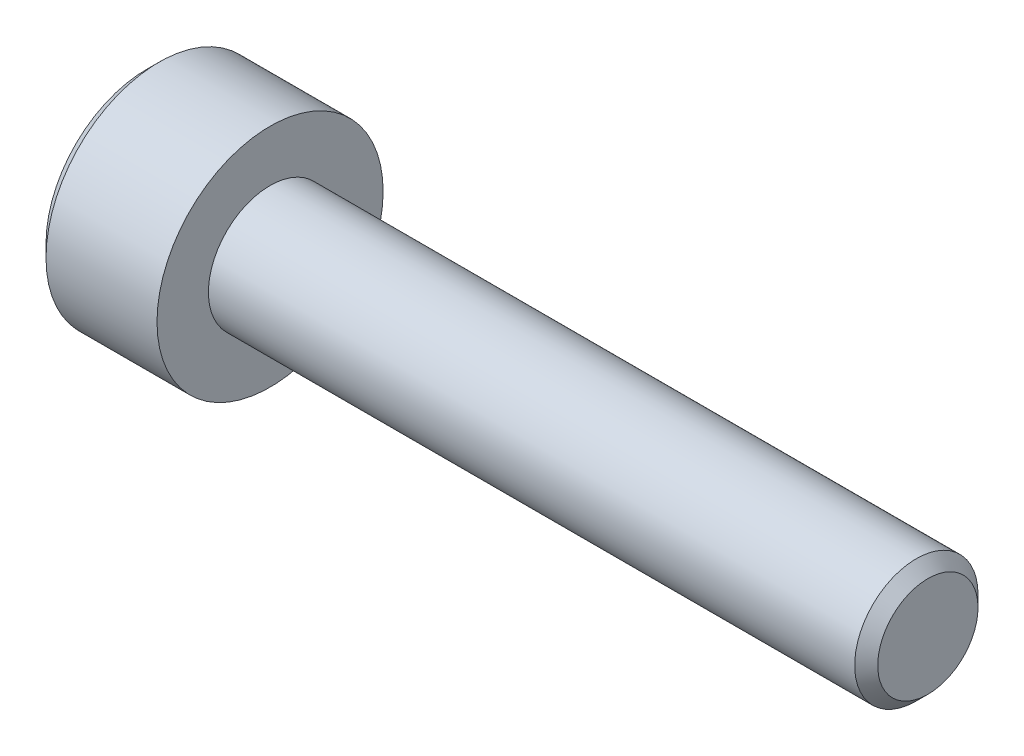
ISO-10303-21;
HEADER;
FILE_DESCRIPTION(('STEP AP214'),'2;1');
FILE_NAME('part.step','',(''),(''),'','','');
FILE_SCHEMA(('AUTOMOTIVE_DESIGN { 1 0 10303 214 1 1 1 1 }'));
ENDSEC;
DATA;
#1=APPLICATION_CONTEXT('core data for automotive mechanical design processes');
#2=APPLICATION_PROTOCOL_DEFINITION('international standard','automotive_design',2000,#1);
#3=PRODUCT_CONTEXT('',#1,'mechanical');
#4=PRODUCT('Part','Part','',(#3));
#5=PRODUCT_RELATED_PRODUCT_CATEGORY('part','',(#4));
#6=PRODUCT_DEFINITION_FORMATION('','',#4);
#7=PRODUCT_DEFINITION_CONTEXT('part definition',#1,'design');
#8=PRODUCT_DEFINITION('design','',#6,#7);
#9=PRODUCT_DEFINITION_SHAPE('','',#8);
#10=(LENGTH_UNIT() NAMED_UNIT(*) SI_UNIT(.MILLI.,.METRE.));
#11=(NAMED_UNIT(*) PLANE_ANGLE_UNIT() SI_UNIT($,.RADIAN.));
#12=(NAMED_UNIT(*) SI_UNIT($,.STERADIAN.) SOLID_ANGLE_UNIT());
#13=UNCERTAINTY_MEASURE_WITH_UNIT(LENGTH_MEASURE(1.E-05),#10,'distance_accuracy_value','');
#14=(GEOMETRIC_REPRESENTATION_CONTEXT(3) GLOBAL_UNCERTAINTY_ASSIGNED_CONTEXT((#13)) GLOBAL_UNIT_ASSIGNED_CONTEXT((#10,
#11,#12)) REPRESENTATION_CONTEXT('',''));
#15=CARTESIAN_POINT('',(0.,0.,0.));
#16=DIRECTION('',(0.,0.,1.));
#17=DIRECTION('',(1.,0.,0.));
#18=AXIS2_PLACEMENT_3D('',#15,#16,#17);
#19=CARTESIAN_POINT('',(1.3,0.,0.));
#20=DIRECTION('',(-1.,0.,0.));
#21=DIRECTION('',(0.,0.,1.));
#22=AXIS2_PLACEMENT_3D('',#19,#20,#21);
#23=CONICAL_SURFACE('',#22,1.28,1.0471975511966);
#24=DIRECTION('',(-0.5,0.,-0.86602540378444));
#25=VECTOR('',#24,1.);
#26=CARTESIAN_POINT('',(1.3,0.,-1.28));
#27=LINE('',#26,#25);
#28=CARTESIAN_POINT('',(2.03900834456273,0.,0.));
#29=VERTEX_POINT('',#28);
#30=CARTESIAN_POINT('',(1.3,0.,-1.28));
#31=VERTEX_POINT('',#30);
#32=EDGE_CURVE('E11',#29,#31,#27,.T.);
#33=ORIENTED_EDGE('',*,*,#32,.T.);
#34=CARTESIAN_POINT('',(1.3,0.,0.));
#35=DIRECTION('',(-1.,0.,0.));
#36=DIRECTION('',(0.,0.,1.));
#37=AXIS2_PLACEMENT_3D('',#34,#35,#36);
#38=CIRCLE('',#37,1.28);
#39=CARTESIAN_POINT('',(1.3,-1.10851251684408,-0.64));
#40=VERTEX_POINT('',#39);
#41=EDGE_CURVE('E221',#31,#40,#38,.T.);
#42=ORIENTED_EDGE('',*,*,#41,.T.);
#43=CARTESIAN_POINT('',(1.3,0.,0.));
#44=DIRECTION('',(-1.,0.,0.));
#45=DIRECTION('',(0.,0.,1.));
#46=AXIS2_PLACEMENT_3D('',#43,#44,#45);
#47=CIRCLE('',#46,1.28);
#48=CARTESIAN_POINT('',(1.3,-1.10851251684408,0.64));
#49=VERTEX_POINT('',#48);
#50=EDGE_CURVE('E216',#40,#49,#47,.T.);
#51=ORIENTED_EDGE('',*,*,#50,.T.);
#52=CARTESIAN_POINT('',(1.3,0.,0.));
#53=DIRECTION('',(-1.,0.,0.));
#54=DIRECTION('',(0.,0.,1.));
#55=AXIS2_PLACEMENT_3D('',#52,#53,#54);
#56=CIRCLE('',#55,1.28);
#57=CARTESIAN_POINT('',(1.3,0.,1.28));
#58=VERTEX_POINT('',#57);
#59=EDGE_CURVE('E220',#49,#58,#56,.T.);
#60=ORIENTED_EDGE('',*,*,#59,.T.);
#61=CARTESIAN_POINT('',(1.3,0.,0.));
#62=DIRECTION('',(-1.,0.,0.));
#63=DIRECTION('',(0.,0.,1.));
#64=AXIS2_PLACEMENT_3D('',#61,#62,#63);
#65=CIRCLE('',#64,1.28);
#66=CARTESIAN_POINT('',(1.3,1.10851251684408,0.64));
#67=VERTEX_POINT('',#66);
#68=EDGE_CURVE('E253',#58,#67,#65,.T.);
#69=ORIENTED_EDGE('',*,*,#68,.T.);
#70=CARTESIAN_POINT('',(1.3,0.,0.));
#71=DIRECTION('',(-1.,0.,0.));
#72=DIRECTION('',(0.,0.,1.));
#73=AXIS2_PLACEMENT_3D('',#70,#71,#72);
#74=CIRCLE('',#73,1.28);
#75=CARTESIAN_POINT('',(1.3,1.10851251684408,-0.64));
#76=VERTEX_POINT('',#75);
#77=EDGE_CURVE('E262',#67,#76,#74,.T.);
#78=ORIENTED_EDGE('',*,*,#77,.T.);
#79=CARTESIAN_POINT('',(1.3,0.,0.));
#80=DIRECTION('',(-1.,0.,0.));
#81=DIRECTION('',(0.,0.,1.));
#82=AXIS2_PLACEMENT_3D('',#79,#80,#81);
#83=CIRCLE('',#82,1.28);
#84=EDGE_CURVE('E28',#76,#31,#83,.T.);
#85=ORIENTED_EDGE('',*,*,#84,.T.);
#86=ORIENTED_EDGE('',*,*,#32,.F.);
#87=EDGE_LOOP('',(#33,#42,#51,#60,#69,#78,#85,#86));
#88=FACE_BOUND('',#87,.T.);
#89=ADVANCED_FACE('F17',(#88),#23,.F.);
#90=CARTESIAN_POINT('',(1.3,1.47801668912544,0.));
#91=DIRECTION('',(1.,0.,0.));
#92=DIRECTION('',(0.,1.,0.));
#93=AXIS2_PLACEMENT_3D('',#90,#91,#92);
#94=PLANE('',#93);
#95=DIRECTION('',(0.,-0.5,-0.866025403784439));
#96=VECTOR('',#95,1.);
#97=CARTESIAN_POINT('',(1.3,1.10851251684408,-0.64));
#98=LINE('',#97,#96);
#99=CARTESIAN_POINT('',(1.3,0.739008344562717,-1.28));
#100=VERTEX_POINT('',#99);
#101=EDGE_CURVE('E337',#76,#100,#98,.T.);
#102=ORIENTED_EDGE('',*,*,#101,.T.);
#103=DIRECTION('',(0.,-1.,0.));
#104=VECTOR('',#103,1.);
#105=CARTESIAN_POINT('',(1.3,0.739008344562717,-1.28));
#106=LINE('',#105,#104);
#107=EDGE_CURVE('E235',#100,#31,#106,.T.);
#108=ORIENTED_EDGE('',*,*,#107,.T.);
#109=ORIENTED_EDGE('',*,*,#84,.F.);
#110=EDGE_LOOP('',(#102,#108,#109));
#111=FACE_BOUND('',#110,.T.);
#112=ADVANCED_FACE('F353',(#111),#94,.F.);
#113=CARTESIAN_POINT('',(1.3,1.47801668912544,0.));
#114=DIRECTION('',(1.,0.,0.));
#115=DIRECTION('',(0.,1.,0.));
#116=AXIS2_PLACEMENT_3D('',#113,#114,#115);
#117=PLANE('',#116);
#118=DIRECTION('',(0.,-0.5,0.866025403784438));
#119=VECTOR('',#118,1.);
#120=CARTESIAN_POINT('',(1.3,1.47801668912544,0.));
#121=LINE('',#120,#119);
#122=CARTESIAN_POINT('',(1.3,1.47801668912544,0.));
#123=VERTEX_POINT('',#122);
#124=EDGE_CURVE('E215',#123,#67,#121,.T.);
#125=ORIENTED_EDGE('',*,*,#124,.F.);
#126=DIRECTION('',(0.,-0.5,-0.866025403784438));
#127=VECTOR('',#126,1.);
#128=CARTESIAN_POINT('',(1.3,1.47801668912544,0.));
#129=LINE('',#128,#127);
#130=EDGE_CURVE('E326',#123,#76,#129,.T.);
#131=ORIENTED_EDGE('',*,*,#130,.T.);
#132=ORIENTED_EDGE('',*,*,#77,.F.);
#133=EDGE_LOOP('',(#125,#131,#132));
#134=FACE_BOUND('',#133,.T.);
#135=ADVANCED_FACE('F378',(#134),#117,.F.);
#136=CARTESIAN_POINT('',(1.3,1.47801668912544,0.));
#137=DIRECTION('',(1.,0.,0.));
#138=DIRECTION('',(0.,1.,0.));
#139=AXIS2_PLACEMENT_3D('',#136,#137,#138);
#140=PLANE('',#139);
#141=DIRECTION('',(0.,1.,0.));
#142=VECTOR('',#141,1.);
#143=CARTESIAN_POINT('',(1.3,0.,1.28));
#144=LINE('',#143,#142);
#145=CARTESIAN_POINT('',(1.3,0.739008344562719,1.28));
#146=VERTEX_POINT('',#145);
#147=EDGE_CURVE('E203',#58,#146,#144,.T.);
#148=ORIENTED_EDGE('',*,*,#147,.T.);
#149=DIRECTION('',(0.,-0.5,0.866025403784439));
#150=VECTOR('',#149,1.);
#151=CARTESIAN_POINT('',(1.3,1.10851251684408,0.64));
#152=LINE('',#151,#150);
#153=EDGE_CURVE('E225',#67,#146,#152,.T.);
#154=ORIENTED_EDGE('',*,*,#153,.F.);
#155=ORIENTED_EDGE('',*,*,#68,.F.);
#156=EDGE_LOOP('',(#148,#154,#155));
#157=FACE_BOUND('',#156,.T.);
#158=ADVANCED_FACE('F370',(#157),#140,.F.);
#159=CARTESIAN_POINT('',(1.3,1.47801668912544,0.));
#160=DIRECTION('',(1.,0.,0.));
#161=DIRECTION('',(0.,1.,0.));
#162=AXIS2_PLACEMENT_3D('',#159,#160,#161);
#163=PLANE('',#162);
#164=DIRECTION('',(0.,-0.5,-0.866025403784439));
#165=VECTOR('',#164,1.);
#166=CARTESIAN_POINT('',(1.3,-0.739008344562723,1.28));
#167=LINE('',#166,#165);
#168=CARTESIAN_POINT('',(1.3,-0.739008344562723,1.28));
#169=VERTEX_POINT('',#168);
#170=EDGE_CURVE('E189',#169,#49,#167,.T.);
#171=ORIENTED_EDGE('',*,*,#170,.F.);
#172=DIRECTION('',(0.,1.,0.));
#173=VECTOR('',#172,1.);
#174=CARTESIAN_POINT('',(1.3,-0.739008344562723,1.28));
#175=LINE('',#174,#173);
#176=EDGE_CURVE('E190',#169,#58,#175,.T.);
#177=ORIENTED_EDGE('',*,*,#176,.T.);
#178=ORIENTED_EDGE('',*,*,#59,.F.);
#179=EDGE_LOOP('',(#171,#177,#178));
#180=FACE_BOUND('',#179,.T.);
#181=ADVANCED_FACE('F364',(#180),#163,.F.);
#182=CARTESIAN_POINT('',(1.3,1.47801668912544,0.));
#183=DIRECTION('',(1.,0.,0.));
#184=DIRECTION('',(0.,1.,0.));
#185=AXIS2_PLACEMENT_3D('',#182,#183,#184);
#186=PLANE('',#185);
#187=DIRECTION('',(0.,0.5,-0.866025403784439));
#188=VECTOR('',#187,1.);
#189=CARTESIAN_POINT('',(1.3,-1.47801668912545,0.));
#190=LINE('',#189,#188);
#191=CARTESIAN_POINT('',(1.3,-1.47801668912545,0.));
#192=VERTEX_POINT('',#191);
#193=EDGE_CURVE('E156',#192,#40,#190,.T.);
#194=ORIENTED_EDGE('',*,*,#193,.F.);
#195=DIRECTION('',(0.,-0.5,-0.866025403784439));
#196=VECTOR('',#195,1.);
#197=CARTESIAN_POINT('',(1.3,-1.10851251684408,0.64));
#198=LINE('',#197,#196);
#199=EDGE_CURVE('E153',#49,#192,#198,.T.);
#200=ORIENTED_EDGE('',*,*,#199,.F.);
#201=ORIENTED_EDGE('',*,*,#50,.F.);
#202=EDGE_LOOP('',(#194,#200,#201));
#203=FACE_BOUND('',#202,.T.);
#204=ADVANCED_FACE('F359',(#203),#186,.F.);
#205=CARTESIAN_POINT('',(1.3,1.47801668912544,0.));
#206=DIRECTION('',(1.,0.,0.));
#207=DIRECTION('',(0.,1.,0.));
#208=AXIS2_PLACEMENT_3D('',#205,#206,#207);
#209=PLANE('',#208);
#210=DIRECTION('',(0.,-1.,0.));
#211=VECTOR('',#210,1.);
#212=CARTESIAN_POINT('',(1.3,0.,-1.28));
#213=LINE('',#212,#211);
#214=CARTESIAN_POINT('',(1.3,-0.739008344562725,-1.28));
#215=VERTEX_POINT('',#214);
#216=EDGE_CURVE('E240',#31,#215,#213,.T.);
#217=ORIENTED_EDGE('',*,*,#216,.T.);
#218=DIRECTION('',(0.,0.5,-0.866025403784439));
#219=VECTOR('',#218,1.);
#220=CARTESIAN_POINT('',(1.3,-1.10851251684409,-0.64));
#221=LINE('',#220,#219);
#222=EDGE_CURVE('E226',#40,#215,#221,.T.);
#223=ORIENTED_EDGE('',*,*,#222,.F.);
#224=ORIENTED_EDGE('',*,*,#41,.F.);
#225=EDGE_LOOP('',(#217,#223,#224));
#226=FACE_BOUND('',#225,.T.);
#227=ADVANCED_FACE('F350',(#226),#209,.F.);
#228=CARTESIAN_POINT('',(1.3,1.47801668912544,0.));
#229=DIRECTION('',(0.,0.866025403784439,-0.5));
#230=DIRECTION('',(-1.,0.,0.));
#231=AXIS2_PLACEMENT_3D('',#228,#229,#230);
#232=PLANE('',#231);
#233=DIRECTION('',(0.,-0.5,-0.866025403784439));
#234=VECTOR('',#233,1.);
#235=CARTESIAN_POINT('',(0.,1.47801668912544,0.));
#236=LINE('',#235,#234);
#237=CARTESIAN_POINT('',(0.,1.47801668912544,0.));
#238=VERTEX_POINT('',#237);
#239=CARTESIAN_POINT('',(0.,0.739008344562717,-1.28));
#240=VERTEX_POINT('',#239);
#241=EDGE_CURVE('E195',#238,#240,#236,.T.);
#242=ORIENTED_EDGE('',*,*,#241,.T.);
#243=DIRECTION('',(-1.,0.,0.));
#244=VECTOR('',#243,1.);
#245=CARTESIAN_POINT('',(1.3,0.739008344562717,-1.28));
#246=LINE('',#245,#244);
#247=EDGE_CURVE('E239',#100,#240,#246,.T.);
#248=ORIENTED_EDGE('',*,*,#247,.F.);
#249=ORIENTED_EDGE('',*,*,#101,.F.);
#250=ORIENTED_EDGE('',*,*,#130,.F.);
#251=DIRECTION('',(-1.,0.,0.));
#252=VECTOR('',#251,1.);
#253=CARTESIAN_POINT('',(1.3,1.47801668912544,0.));
#254=LINE('',#253,#252);
#255=EDGE_CURVE('E184',#123,#238,#254,.T.);
#256=ORIENTED_EDGE('',*,*,#255,.T.);
#257=EDGE_LOOP('',(#242,#248,#249,#250,#256));
#258=FACE_BOUND('',#257,.T.);
#259=ADVANCED_FACE('F381',(#258),#232,.F.);
#260=CARTESIAN_POINT('',(1.3,0.739008344562717,-1.28));
#261=DIRECTION('',(0.,0.,-1.));
#262=DIRECTION('',(0.,-1.,0.));
#263=AXIS2_PLACEMENT_3D('',#260,#261,#262);
#264=PLANE('',#263);
#265=DIRECTION('',(0.,-1.,0.));
#266=VECTOR('',#265,1.);
#267=CARTESIAN_POINT('',(0.,0.739008344562717,-1.28));
#268=LINE('',#267,#266);
#269=CARTESIAN_POINT('',(0.,-0.739008344562725,-1.28));
#270=VERTEX_POINT('',#269);
#271=EDGE_CURVE('E164',#240,#270,#268,.T.);
#272=ORIENTED_EDGE('',*,*,#271,.T.);
#273=DIRECTION('',(-1.,0.,0.));
#274=VECTOR('',#273,1.);
#275=CARTESIAN_POINT('',(1.3,-0.739008344562725,-1.28));
#276=LINE('',#275,#274);
#277=EDGE_CURVE('E134',#215,#270,#276,.T.);
#278=ORIENTED_EDGE('',*,*,#277,.F.);
#279=ORIENTED_EDGE('',*,*,#216,.F.);
#280=ORIENTED_EDGE('',*,*,#107,.F.);
#281=ORIENTED_EDGE('',*,*,#247,.T.);
#282=EDGE_LOOP('',(#272,#278,#279,#280,#281));
#283=FACE_BOUND('',#282,.T.);
#284=ADVANCED_FACE('F357',(#283),#264,.F.);
#285=CARTESIAN_POINT('',(1.3,-1.47801668912545,0.));
#286=DIRECTION('',(0.,0.866025403784439,0.5));
#287=DIRECTION('',(1.,0.,0.));
#288=AXIS2_PLACEMENT_3D('',#285,#286,#287);
#289=PLANE('',#288);
#290=DIRECTION('',(0.,0.5,-0.866025403784439));
#291=VECTOR('',#290,1.);
#292=CARTESIAN_POINT('',(0.,-1.47801668912545,0.));
#293=LINE('',#292,#291);
#294=CARTESIAN_POINT('',(0.,-1.47801668912545,0.));
#295=VERTEX_POINT('',#294);
#296=EDGE_CURVE('E159',#295,#270,#293,.T.);
#297=ORIENTED_EDGE('',*,*,#296,.F.);
#298=DIRECTION('',(-1.,0.,0.));
#299=VECTOR('',#298,1.);
#300=CARTESIAN_POINT('',(1.3,-1.47801668912545,0.));
#301=LINE('',#300,#299);
#302=EDGE_CURVE('E145',#192,#295,#301,.T.);
#303=ORIENTED_EDGE('',*,*,#302,.F.);
#304=ORIENTED_EDGE('',*,*,#193,.T.);
#305=ORIENTED_EDGE('',*,*,#222,.T.);
#306=ORIENTED_EDGE('',*,*,#277,.T.);
#307=EDGE_LOOP('',(#297,#303,#304,#305,#306));
#308=FACE_BOUND('',#307,.T.);
#309=ADVANCED_FACE('F160',(#308),#289,.T.);
#310=CARTESIAN_POINT('',(1.3,-0.739008344562723,1.28));
#311=DIRECTION('',(0.,0.866025403784439,-0.5));
#312=DIRECTION('',(-1.,0.,0.));
#313=AXIS2_PLACEMENT_3D('',#310,#311,#312);
#314=PLANE('',#313);
#315=DIRECTION('',(0.,-0.5,-0.866025403784439));
#316=VECTOR('',#315,1.);
#317=CARTESIAN_POINT('',(0.,-0.739008344562723,1.28));
#318=LINE('',#317,#316);
#319=CARTESIAN_POINT('',(0.,-0.739008344562723,1.28));
#320=VERTEX_POINT('',#319);
#321=EDGE_CURVE('E149',#320,#295,#318,.T.);
#322=ORIENTED_EDGE('',*,*,#321,.F.);
#323=DIRECTION('',(-1.,0.,0.));
#324=VECTOR('',#323,1.);
#325=CARTESIAN_POINT('',(1.3,-0.739008344562723,1.28));
#326=LINE('',#325,#324);
#327=EDGE_CURVE('E186',#169,#320,#326,.T.);
#328=ORIENTED_EDGE('',*,*,#327,.F.);
#329=ORIENTED_EDGE('',*,*,#170,.T.);
#330=ORIENTED_EDGE('',*,*,#199,.T.);
#331=ORIENTED_EDGE('',*,*,#302,.T.);
#332=EDGE_LOOP('',(#322,#328,#329,#330,#331));
#333=FACE_BOUND('',#332,.T.);
#334=ADVANCED_FACE('F146',(#333),#314,.T.);
#335=CARTESIAN_POINT('',(1.3,-0.739008344562723,1.28));
#336=DIRECTION('',(0.,0.,1.));
#337=DIRECTION('',(0.,-1.,0.));
#338=AXIS2_PLACEMENT_3D('',#335,#336,#337);
#339=PLANE('',#338);
#340=DIRECTION('',(0.,1.,0.));
#341=VECTOR('',#340,1.);
#342=CARTESIAN_POINT('',(0.,-0.739008344562723,1.28));
#343=LINE('',#342,#341);
#344=CARTESIAN_POINT('',(0.,0.739008344562719,1.28));
#345=VERTEX_POINT('',#344);
#346=EDGE_CURVE('E170',#320,#345,#343,.T.);
#347=ORIENTED_EDGE('',*,*,#346,.T.);
#348=DIRECTION('',(-1.,0.,0.));
#349=VECTOR('',#348,1.);
#350=CARTESIAN_POINT('',(1.3,0.739008344562719,1.28));
#351=LINE('',#350,#349);
#352=EDGE_CURVE('E256',#146,#345,#351,.T.);
#353=ORIENTED_EDGE('',*,*,#352,.F.);
#354=ORIENTED_EDGE('',*,*,#147,.F.);
#355=ORIENTED_EDGE('',*,*,#176,.F.);
#356=ORIENTED_EDGE('',*,*,#327,.T.);
#357=EDGE_LOOP('',(#347,#353,#354,#355,#356));
#358=FACE_BOUND('',#357,.T.);
#359=ADVANCED_FACE('F367',(#358),#339,.F.);
#360=CARTESIAN_POINT('',(1.3,1.47801668912544,0.));
#361=DIRECTION('',(0.,-0.866025403784439,-0.5));
#362=DIRECTION('',(0.,0.5,-0.866025403784439));
#363=AXIS2_PLACEMENT_3D('',#360,#361,#362);
#364=PLANE('',#363);
#365=DIRECTION('',(0.,-0.5,0.866025403784439));
#366=VECTOR('',#365,1.);
#367=CARTESIAN_POINT('',(0.,1.47801668912544,0.));
#368=LINE('',#367,#366);
#369=EDGE_CURVE('E177',#238,#345,#368,.T.);
#370=ORIENTED_EDGE('',*,*,#369,.F.);
#371=ORIENTED_EDGE('',*,*,#255,.F.);
#372=ORIENTED_EDGE('',*,*,#124,.T.);
#373=ORIENTED_EDGE('',*,*,#153,.T.);
#374=ORIENTED_EDGE('',*,*,#352,.T.);
#375=EDGE_LOOP('',(#370,#371,#372,#373,#374));
#376=FACE_BOUND('',#375,.T.);
#377=ADVANCED_FACE('F19',(#376),#364,.T.);
#378=CARTESIAN_POINT('',(0.,0.,0.));
#379=DIRECTION('',(1.,0.,0.));
#380=DIRECTION('',(0.,0.,-1.));
#381=AXIS2_PLACEMENT_3D('',#378,#379,#380);
#382=CONICAL_SURFACE('',#381,2.45,0.785398163397442);
#383=CARTESIAN_POINT('',(0.3,0.,0.));
#384=DIRECTION('',(-1.,0.,0.));
#385=DIRECTION('',(0.,0.,1.));
#386=AXIS2_PLACEMENT_3D('',#383,#384,#385);
#387=CIRCLE('',#386,2.75);
#388=CARTESIAN_POINT('',(0.3,0.,2.75));
#389=VERTEX_POINT('',#388);
#390=CARTESIAN_POINT('',(0.3,0.,-2.75));
#391=VERTEX_POINT('',#390);
#392=EDGE_CURVE('E207',#389,#391,#387,.T.);
#393=ORIENTED_EDGE('',*,*,#392,.T.);
#394=CARTESIAN_POINT('',(0.3,0.,0.));
#395=DIRECTION('',(-1.,0.,0.));
#396=DIRECTION('',(0.,0.,1.));
#397=AXIS2_PLACEMENT_3D('',#394,#395,#396);
#398=CIRCLE('',#397,2.75);
#399=EDGE_CURVE('E194',#391,#389,#398,.T.);
#400=ORIENTED_EDGE('',*,*,#399,.T.);
#401=DIRECTION('',(-0.707106781186552,0.,-0.707106781186543));
#402=VECTOR('',#401,1.);
#403=CARTESIAN_POINT('',(0.,0.,2.45));
#404=LINE('',#403,#402);
#405=CARTESIAN_POINT('',(0.,0.,2.45));
#406=VERTEX_POINT('',#405);
#407=EDGE_CURVE('E181',#389,#406,#404,.T.);
#408=ORIENTED_EDGE('',*,*,#407,.T.);
#409=CARTESIAN_POINT('',(0.,0.,0.));
#410=DIRECTION('',(-1.,0.,0.));
#411=DIRECTION('',(0.,0.,1.));
#412=AXIS2_PLACEMENT_3D('',#409,#410,#411);
#413=CIRCLE('',#412,2.45);
#414=EDGE_CURVE('E241',#406,#406,#413,.T.);
#415=ORIENTED_EDGE('',*,*,#414,.F.);
#416=ORIENTED_EDGE('',*,*,#407,.F.);
#417=EDGE_LOOP('',(#393,#400,#408,#415,#416));
#418=FACE_BOUND('',#417,.T.);
#419=ADVANCED_FACE('F271',(#418),#382,.T.);
#420=CARTESIAN_POINT('',(-31.75,0.,0.));
#421=DIRECTION('',(-1.,0.,0.));
#422=DIRECTION('',(0.,0.,1.));
#423=AXIS2_PLACEMENT_3D('',#420,#421,#422);
#424=CYLINDRICAL_SURFACE('',#423,2.75);
#425=ORIENTED_EDGE('',*,*,#392,.F.);
#426=ORIENTED_EDGE('',*,*,#399,.F.);
#427=DIRECTION('',(1.,0.,0.));
#428=VECTOR('',#427,1.);
#429=CARTESIAN_POINT('',(-31.75,0.,-2.75));
#430=LINE('',#429,#428);
#431=CARTESIAN_POINT('',(3.,0.,-2.75));
#432=VERTEX_POINT('',#431);
#433=EDGE_CURVE('E185',#391,#432,#430,.T.);
#434=ORIENTED_EDGE('',*,*,#433,.T.);
#435=CARTESIAN_POINT('',(3.,0.,0.));
#436=DIRECTION('',(-1.,0.,0.));
#437=DIRECTION('',(0.,0.,1.));
#438=AXIS2_PLACEMENT_3D('',#435,#436,#437);
#439=CIRCLE('',#438,2.75);
#440=EDGE_CURVE('E249',#432,#432,#439,.T.);
#441=ORIENTED_EDGE('',*,*,#440,.T.);
#442=ORIENTED_EDGE('',*,*,#433,.F.);
#443=EDGE_LOOP('',(#425,#426,#434,#441,#442));
#444=FACE_BOUND('',#443,.T.);
#445=ADVANCED_FACE('F275',(#444),#424,.T.);
#446=CARTESIAN_POINT('',(-31.75,0.,0.));
#447=DIRECTION('',(-1.,0.,0.));
#448=DIRECTION('',(0.,0.,1.));
#449=AXIS2_PLACEMENT_3D('',#446,#447,#448);
#450=CYLINDRICAL_SURFACE('',#449,1.5);
#451=CARTESIAN_POINT('',(3.,0.,0.));
#452=DIRECTION('',(1.,0.,0.));
#453=DIRECTION('',(0.,0.,1.));
#454=AXIS2_PLACEMENT_3D('',#451,#452,#453);
#455=CIRCLE('',#454,1.5);
#456=CARTESIAN_POINT('',(3.,0.,-1.5));
#457=VERTEX_POINT('',#456);
#458=EDGE_CURVE('E245',#457,#457,#455,.T.);
#459=ORIENTED_EDGE('',*,*,#458,.T.);
#460=DIRECTION('',(1.,0.,0.));
#461=VECTOR('',#460,1.);
#462=CARTESIAN_POINT('',(-31.75,0.,-1.5));
#463=LINE('',#462,#461);
#464=CARTESIAN_POINT('',(18.7195,0.,-1.49999999999997));
#465=VERTEX_POINT('',#464);
#466=EDGE_CURVE('E204',#457,#465,#463,.T.);
#467=ORIENTED_EDGE('',*,*,#466,.T.);
#468=CARTESIAN_POINT('',(18.7195,0.,0.));
#469=DIRECTION('',(-1.,0.,0.));
#470=DIRECTION('',(0.,0.,1.));
#471=AXIS2_PLACEMENT_3D('',#468,#469,#470);
#472=CIRCLE('',#471,1.49999999999997);
#473=EDGE_CURVE('E234',#465,#465,#472,.T.);
#474=ORIENTED_EDGE('',*,*,#473,.T.);
#475=ORIENTED_EDGE('',*,*,#466,.F.);
#476=EDGE_LOOP('',(#459,#467,#474,#475));
#477=FACE_BOUND('',#476,.T.);
#478=ADVANCED_FACE('F412',(#477),#450,.T.);
#479=CARTESIAN_POINT('',(19.,0.,0.));
#480=DIRECTION('',(-1.,0.,0.));
#481=DIRECTION('',(0.,0.,1.));
#482=AXIS2_PLACEMENT_3D('',#479,#480,#481);
#483=CONICAL_SURFACE('',#482,1.2195,0.7853981633974);
#484=ORIENTED_EDGE('',*,*,#473,.F.);
#485=DIRECTION('',(0.707106781186582,0.,0.707106781186513));
#486=VECTOR('',#485,1.);
#487=CARTESIAN_POINT('',(19.,0.,-1.2195));
#488=LINE('',#487,#486);
#489=CARTESIAN_POINT('',(19.,0.,-1.2195));
#490=VERTEX_POINT('',#489);
#491=EDGE_CURVE('E21',#465,#490,#488,.T.);
#492=ORIENTED_EDGE('',*,*,#491,.T.);
#493=CARTESIAN_POINT('',(19.,0.,0.));
#494=DIRECTION('',(-1.,0.,0.));
#495=DIRECTION('',(0.,0.,1.));
#496=AXIS2_PLACEMENT_3D('',#493,#494,#495);
#497=CIRCLE('',#496,1.2195);
#498=EDGE_CURVE('E199',#490,#490,#497,.T.);
#499=ORIENTED_EDGE('',*,*,#498,.T.);
#500=ORIENTED_EDGE('',*,*,#491,.F.);
#501=EDGE_LOOP('',(#484,#492,#499,#500));
#502=FACE_BOUND('',#501,.T.);
#503=ADVANCED_FACE('F399',(#502),#483,.T.);
#504=CARTESIAN_POINT('',(19.,1.2195,0.));
#505=DIRECTION('',(1.,0.,0.));
#506=DIRECTION('',(0.,0.,1.));
#507=AXIS2_PLACEMENT_3D('',#504,#505,#506);
#508=PLANE('',#507);
#509=ORIENTED_EDGE('',*,*,#498,.F.);
#510=EDGE_LOOP('',(#509));
#511=FACE_BOUND('',#510,.T.);
#512=ADVANCED_FACE('F402',(#511),#508,.T.);
#513=CARTESIAN_POINT('',(0.,0.,0.));
#514=DIRECTION('',(-1.,0.,0.));
#515=DIRECTION('',(0.,0.,1.));
#516=AXIS2_PLACEMENT_3D('',#513,#514,#515);
#517=PLANE('',#516);
#518=ORIENTED_EDGE('',*,*,#369,.T.);
#519=ORIENTED_EDGE('',*,*,#346,.F.);
#520=ORIENTED_EDGE('',*,*,#321,.T.);
#521=ORIENTED_EDGE('',*,*,#296,.T.);
#522=ORIENTED_EDGE('',*,*,#271,.F.);
#523=ORIENTED_EDGE('',*,*,#241,.F.);
#524=EDGE_LOOP('',(#518,#519,#520,#521,#522,#523));
#525=FACE_BOUND('',#524,.T.);
#526=ORIENTED_EDGE('',*,*,#414,.T.);
#527=EDGE_LOOP('',(#526));
#528=FACE_BOUND('',#527,.T.);
#529=ADVANCED_FACE('F167',(#525,#528),#517,.T.);
#530=CARTESIAN_POINT('',(3.,2.75,0.));
#531=DIRECTION('',(1.,0.,0.));
#532=DIRECTION('',(0.,1.,0.));
#533=AXIS2_PLACEMENT_3D('',#530,#531,#532);
#534=PLANE('',#533);
#535=ORIENTED_EDGE('',*,*,#458,.F.);
#536=EDGE_LOOP('',(#535));
#537=FACE_BOUND('',#536,.T.);
#538=ORIENTED_EDGE('',*,*,#440,.F.);
#539=EDGE_LOOP('',(#538));
#540=FACE_BOUND('',#539,.T.);
#541=ADVANCED_FACE('F410',(#537,#540),#534,.T.);
#542=CLOSED_SHELL('',(#89,#112,#135,#158,#181,#204,#227,#259,#284,#309,#334,#359,#377,#419,#445,
#478,#503,#512,#529,#541));
#543=MANIFOLD_SOLID_BREP('B1',#542);
#544=ADVANCED_BREP_SHAPE_REPRESENTATION('',(#18,#543),#14);
#545=SHAPE_DEFINITION_REPRESENTATION(#9,#544);
ENDSEC;
END-ISO-10303-21;
